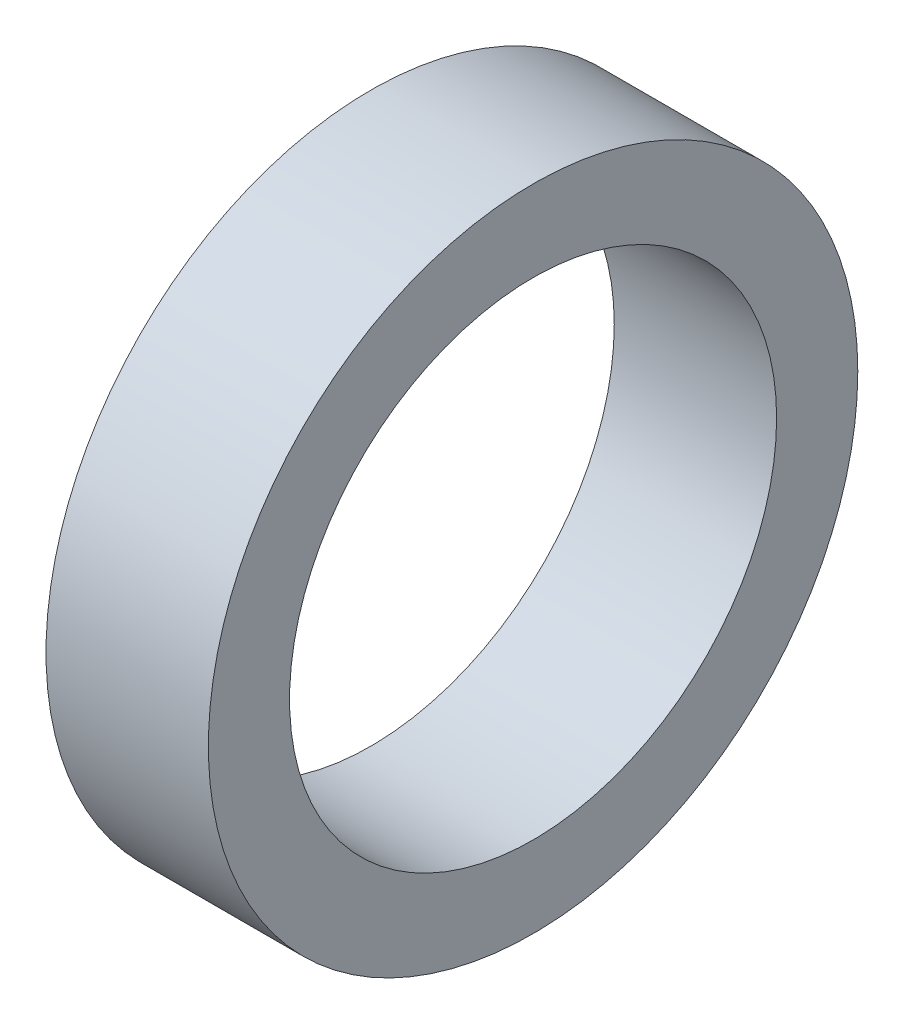
ISO-10303-21;
HEADER;
FILE_DESCRIPTION(('STEP AP214'),'2;1');
FILE_NAME('part.step','',(''),(''),'','','');
FILE_SCHEMA(('AUTOMOTIVE_DESIGN { 1 0 10303 214 1 1 1 1 }'));
ENDSEC;
DATA;
#1=APPLICATION_CONTEXT('core data for automotive mechanical design processes');
#2=APPLICATION_PROTOCOL_DEFINITION('international standard','automotive_design',2000,#1);
#3=PRODUCT_CONTEXT('',#1,'mechanical');
#4=PRODUCT('Part','Part','',(#3));
#5=PRODUCT_RELATED_PRODUCT_CATEGORY('part','',(#4));
#6=PRODUCT_DEFINITION_FORMATION('','',#4);
#7=PRODUCT_DEFINITION_CONTEXT('part definition',#1,'design');
#8=PRODUCT_DEFINITION('design','',#6,#7);
#9=PRODUCT_DEFINITION_SHAPE('','',#8);
#10=(LENGTH_UNIT() NAMED_UNIT(*) SI_UNIT(.MILLI.,.METRE.));
#11=(NAMED_UNIT(*) PLANE_ANGLE_UNIT() SI_UNIT($,.RADIAN.));
#12=(NAMED_UNIT(*) SI_UNIT($,.STERADIAN.) SOLID_ANGLE_UNIT());
#13=UNCERTAINTY_MEASURE_WITH_UNIT(LENGTH_MEASURE(1.E-05),#10,'distance_accuracy_value','');
#14=(GEOMETRIC_REPRESENTATION_CONTEXT(3) GLOBAL_UNCERTAINTY_ASSIGNED_CONTEXT((#13)) GLOBAL_UNIT_ASSIGNED_CONTEXT((#10,
#11,#12)) REPRESENTATION_CONTEXT('',''));
#15=CARTESIAN_POINT('',(0.,0.,0.));
#16=DIRECTION('',(0.,0.,1.));
#17=DIRECTION('',(1.,0.,0.));
#18=AXIS2_PLACEMENT_3D('',#15,#16,#17);
#19=CARTESIAN_POINT('',(1.5875,0.,0.));
#20=DIRECTION('',(1.,0.,0.));
#21=DIRECTION('',(0.,0.,-1.));
#22=AXIS2_PLACEMENT_3D('',#19,#20,#21);
#23=PLANE('',#22);
#24=CARTESIAN_POINT('',(1.5875,0.,0.));
#25=DIRECTION('',(1.,0.,0.));
#26=DIRECTION('',(0.,0.,-1.));
#27=AXIS2_PLACEMENT_3D('',#24,#25,#26);
#28=CIRCLE('',#27,3.175);
#29=CARTESIAN_POINT('',(1.5875,0.,-3.175));
#30=VERTEX_POINT('',#29);
#31=EDGE_CURVE('E10',#30,#30,#28,.T.);
#32=ORIENTED_EDGE('',*,*,#31,.T.);
#33=EDGE_LOOP('',(#32));
#34=FACE_BOUND('',#33,.T.);
#35=CARTESIAN_POINT('',(1.5875,0.,0.));
#36=DIRECTION('',(1.,0.,0.));
#37=DIRECTION('',(0.,0.,-1.));
#38=AXIS2_PLACEMENT_3D('',#35,#36,#37);
#39=CIRCLE('',#38,2.38125);
#40=CARTESIAN_POINT('',(1.5875,0.,-2.38125));
#41=VERTEX_POINT('',#40);
#42=EDGE_CURVE('E44',#41,#41,#39,.T.);
#43=ORIENTED_EDGE('',*,*,#42,.F.);
#44=EDGE_LOOP('',(#43));
#45=FACE_BOUND('',#44,.T.);
#46=ADVANCED_FACE('F33',(#34,#45),#23,.T.);
#47=CARTESIAN_POINT('',(0.,0.,0.));
#48=DIRECTION('',(1.,0.,0.));
#49=DIRECTION('',(0.,0.,-1.));
#50=AXIS2_PLACEMENT_3D('',#47,#48,#49);
#51=PLANE('',#50);
#52=CARTESIAN_POINT('',(0.,0.,0.));
#53=DIRECTION('',(1.,0.,0.));
#54=DIRECTION('',(0.,0.,-1.));
#55=AXIS2_PLACEMENT_3D('',#52,#53,#54);
#56=CIRCLE('',#55,3.175);
#57=CARTESIAN_POINT('',(0.,0.,-3.175));
#58=VERTEX_POINT('',#57);
#59=EDGE_CURVE('E37',#58,#58,#56,.T.);
#60=ORIENTED_EDGE('',*,*,#59,.F.);
#61=EDGE_LOOP('',(#60));
#62=FACE_BOUND('',#61,.T.);
#63=CARTESIAN_POINT('',(0.,0.,0.));
#64=DIRECTION('',(1.,0.,0.));
#65=DIRECTION('',(0.,0.,-1.));
#66=AXIS2_PLACEMENT_3D('',#63,#64,#65);
#67=CIRCLE('',#66,2.38125);
#68=CARTESIAN_POINT('',(0.,0.,-2.38125));
#69=VERTEX_POINT('',#68);
#70=EDGE_CURVE('E46',#69,#69,#67,.T.);
#71=ORIENTED_EDGE('',*,*,#70,.T.);
#72=EDGE_LOOP('',(#71));
#73=FACE_BOUND('',#72,.T.);
#74=ADVANCED_FACE('F56',(#62,#73),#51,.F.);
#75=CARTESIAN_POINT('',(1.5875,0.,0.));
#76=DIRECTION('',(-1.,0.,0.));
#77=DIRECTION('',(0.,0.,1.));
#78=AXIS2_PLACEMENT_3D('',#75,#76,#77);
#79=CYLINDRICAL_SURFACE('',#78,3.175);
#80=ORIENTED_EDGE('',*,*,#31,.F.);
#81=EDGE_LOOP('',(#80));
#82=FACE_BOUND('',#81,.T.);
#83=ORIENTED_EDGE('',*,*,#59,.T.);
#84=EDGE_LOOP('',(#83));
#85=FACE_BOUND('',#84,.T.);
#86=ADVANCED_FACE('F35',(#82,#85),#79,.T.);
#87=CARTESIAN_POINT('',(1.5875,0.,0.));
#88=DIRECTION('',(-1.,0.,0.));
#89=DIRECTION('',(0.,0.,1.));
#90=AXIS2_PLACEMENT_3D('',#87,#88,#89);
#91=CYLINDRICAL_SURFACE('',#90,2.38125);
#92=ORIENTED_EDGE('',*,*,#42,.T.);
#93=EDGE_LOOP('',(#92));
#94=FACE_BOUND('',#93,.T.);
#95=ORIENTED_EDGE('',*,*,#70,.F.);
#96=EDGE_LOOP('',(#95));
#97=FACE_BOUND('',#96,.T.);
#98=ADVANCED_FACE('F52',(#94,#97),#91,.F.);
#99=CLOSED_SHELL('',(#46,#74,#86,#98));
#100=MANIFOLD_SOLID_BREP('B2',#99);
#101=ADVANCED_BREP_SHAPE_REPRESENTATION('',(#18,#100),#14);
#102=SHAPE_DEFINITION_REPRESENTATION(#9,#101);
ENDSEC;
END-ISO-10303-21;
